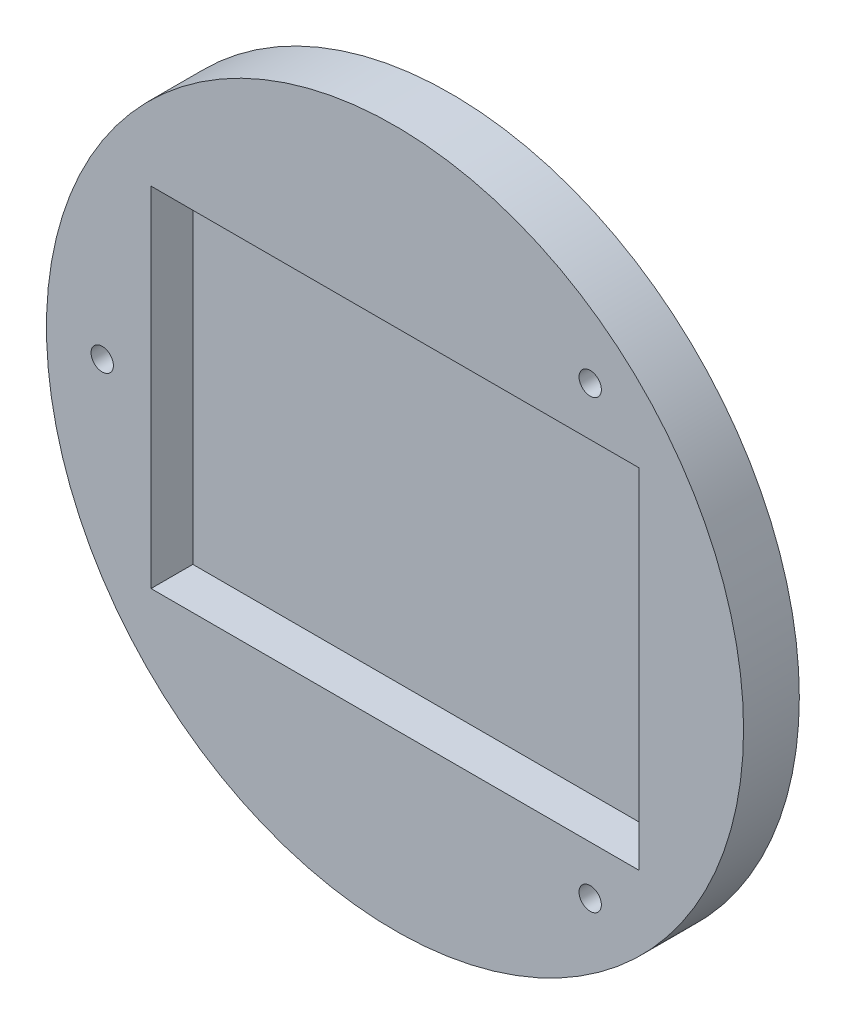
ISO-10303-21;
HEADER;
FILE_DESCRIPTION(('STEP AP214'),'2;1');
FILE_NAME('part.step','',(''),(''),'','','');
FILE_SCHEMA(('AUTOMOTIVE_DESIGN { 1 0 10303 214 1 1 1 1 }'));
ENDSEC;
DATA;
#1=APPLICATION_CONTEXT('core data for automotive mechanical design processes');
#2=APPLICATION_PROTOCOL_DEFINITION('international standard','automotive_design',2000,#1);
#3=PRODUCT_CONTEXT('',#1,'mechanical');
#4=PRODUCT('Part','Part','',(#3));
#5=PRODUCT_RELATED_PRODUCT_CATEGORY('part','',(#4));
#6=PRODUCT_DEFINITION_FORMATION('','',#4);
#7=PRODUCT_DEFINITION_CONTEXT('part definition',#1,'design');
#8=PRODUCT_DEFINITION('design','',#6,#7);
#9=PRODUCT_DEFINITION_SHAPE('','',#8);
#10=(LENGTH_UNIT() NAMED_UNIT(*) SI_UNIT(.MILLI.,.METRE.));
#11=(NAMED_UNIT(*) PLANE_ANGLE_UNIT() SI_UNIT($,.RADIAN.));
#12=(NAMED_UNIT(*) SI_UNIT($,.STERADIAN.) SOLID_ANGLE_UNIT());
#13=UNCERTAINTY_MEASURE_WITH_UNIT(LENGTH_MEASURE(1.E-05),#10,'distance_accuracy_value','');
#14=(GEOMETRIC_REPRESENTATION_CONTEXT(3) GLOBAL_UNCERTAINTY_ASSIGNED_CONTEXT((#13)) GLOBAL_UNIT_ASSIGNED_CONTEXT((#10,
#11,#12)) REPRESENTATION_CONTEXT('',''));
#15=CARTESIAN_POINT('',(0.,0.,0.));
#16=DIRECTION('',(0.,0.,1.));
#17=DIRECTION('',(1.,0.,0.));
#18=AXIS2_PLACEMENT_3D('',#15,#16,#17);
#19=CARTESIAN_POINT('',(0.,12.5,4.));
#20=DIRECTION('',(0.,1.,0.));
#21=DIRECTION('',(0.,0.,1.));
#22=AXIS2_PLACEMENT_3D('',#19,#20,#21);
#23=PLANE('',#22);
#24=DIRECTION('',(0.,0.,-1.));
#25=VECTOR('',#24,1.);
#26=CARTESIAN_POINT('',(-17.5,12.5,4.));
#27=LINE('',#26,#25);
#28=CARTESIAN_POINT('',(-17.5,12.5,4.));
#29=VERTEX_POINT('',#28);
#30=CARTESIAN_POINT('',(-17.5,12.5,1.));
#31=VERTEX_POINT('',#30);
#32=EDGE_CURVE('E91',#29,#31,#27,.T.);
#33=ORIENTED_EDGE('',*,*,#32,.T.);
#34=DIRECTION('',(1.,0.,0.));
#35=VECTOR('',#34,1.);
#36=CARTESIAN_POINT('',(0.,12.5,1.));
#37=LINE('',#36,#35);
#38=CARTESIAN_POINT('',(17.5,12.5,1.));
#39=VERTEX_POINT('',#38);
#40=EDGE_CURVE('E54',#31,#39,#37,.T.);
#41=ORIENTED_EDGE('',*,*,#40,.T.);
#42=DIRECTION('',(0.,0.,-1.));
#43=VECTOR('',#42,1.);
#44=CARTESIAN_POINT('',(17.5,12.5,4.));
#45=LINE('',#44,#43);
#46=CARTESIAN_POINT('',(17.5,12.5,4.));
#47=VERTEX_POINT('',#46);
#48=EDGE_CURVE('E11',#47,#39,#45,.T.);
#49=ORIENTED_EDGE('',*,*,#48,.F.);
#50=DIRECTION('',(1.,0.,0.));
#51=VECTOR('',#50,1.);
#52=CARTESIAN_POINT('',(0.,12.5,4.));
#53=LINE('',#52,#51);
#54=EDGE_CURVE('E107',#29,#47,#53,.T.);
#55=ORIENTED_EDGE('',*,*,#54,.F.);
#56=EDGE_LOOP('',(#33,#41,#49,#55));
#57=FACE_BOUND('',#56,.T.);
#58=ADVANCED_FACE('F38',(#57),#23,.F.);
#59=CARTESIAN_POINT('',(17.5,0.,4.));
#60=DIRECTION('',(1.,0.,0.));
#61=DIRECTION('',(0.,0.,-1.));
#62=AXIS2_PLACEMENT_3D('',#59,#60,#61);
#63=PLANE('',#62);
#64=ORIENTED_EDGE('',*,*,#48,.T.);
#65=DIRECTION('',(0.,-1.,0.));
#66=VECTOR('',#65,1.);
#67=CARTESIAN_POINT('',(17.5,0.,1.));
#68=LINE('',#67,#66);
#69=CARTESIAN_POINT('',(17.5,-12.5,1.));
#70=VERTEX_POINT('',#69);
#71=EDGE_CURVE('E60',#39,#70,#68,.T.);
#72=ORIENTED_EDGE('',*,*,#71,.T.);
#73=DIRECTION('',(0.,0.,-1.));
#74=VECTOR('',#73,1.);
#75=CARTESIAN_POINT('',(17.5,-12.5,4.));
#76=LINE('',#75,#74);
#77=CARTESIAN_POINT('',(17.5,-12.5,4.));
#78=VERTEX_POINT('',#77);
#79=EDGE_CURVE('E47',#78,#70,#76,.T.);
#80=ORIENTED_EDGE('',*,*,#79,.F.);
#81=DIRECTION('',(0.,-1.,0.));
#82=VECTOR('',#81,1.);
#83=CARTESIAN_POINT('',(17.5,0.,4.));
#84=LINE('',#83,#82);
#85=EDGE_CURVE('E110',#47,#78,#84,.T.);
#86=ORIENTED_EDGE('',*,*,#85,.F.);
#87=EDGE_LOOP('',(#64,#72,#80,#86));
#88=FACE_BOUND('',#87,.T.);
#89=ADVANCED_FACE('F121',(#88),#63,.F.);
#90=CARTESIAN_POINT('',(0.,-12.5,4.));
#91=DIRECTION('',(0.,1.,0.));
#92=DIRECTION('',(0.,0.,1.));
#93=AXIS2_PLACEMENT_3D('',#90,#91,#92);
#94=PLANE('',#93);
#95=DIRECTION('',(1.,0.,0.));
#96=VECTOR('',#95,1.);
#97=CARTESIAN_POINT('',(0.,-12.5,1.));
#98=LINE('',#97,#96);
#99=CARTESIAN_POINT('',(-17.5,-12.5,1.));
#100=VERTEX_POINT('',#99);
#101=EDGE_CURVE('E94',#100,#70,#98,.T.);
#102=ORIENTED_EDGE('',*,*,#101,.F.);
#103=DIRECTION('',(0.,0.,-1.));
#104=VECTOR('',#103,1.);
#105=CARTESIAN_POINT('',(-17.5,-12.5,4.));
#106=LINE('',#105,#104);
#107=CARTESIAN_POINT('',(-17.5,-12.5,4.));
#108=VERTEX_POINT('',#107);
#109=EDGE_CURVE('E81',#108,#100,#106,.T.);
#110=ORIENTED_EDGE('',*,*,#109,.F.);
#111=DIRECTION('',(1.,0.,0.));
#112=VECTOR('',#111,1.);
#113=CARTESIAN_POINT('',(0.,-12.5,4.));
#114=LINE('',#113,#112);
#115=EDGE_CURVE('E112',#108,#78,#114,.T.);
#116=ORIENTED_EDGE('',*,*,#115,.T.);
#117=ORIENTED_EDGE('',*,*,#79,.T.);
#118=EDGE_LOOP('',(#102,#110,#116,#117));
#119=FACE_BOUND('',#118,.T.);
#120=ADVANCED_FACE('F95',(#119),#94,.T.);
#121=CARTESIAN_POINT('',(0.,0.,4.));
#122=DIRECTION('',(0.,0.,-1.));
#123=DIRECTION('',(-1.,0.,0.));
#124=AXIS2_PLACEMENT_3D('',#121,#122,#123);
#125=CYLINDRICAL_SURFACE('',#124,25.);
#126=CARTESIAN_POINT('',(0.,0.,4.));
#127=DIRECTION('',(0.,0.,1.));
#128=DIRECTION('',(1.,0.,0.));
#129=AXIS2_PLACEMENT_3D('',#126,#127,#128);
#130=CIRCLE('',#129,25.);
#131=CARTESIAN_POINT('',(25.,0.,4.));
#132=VERTEX_POINT('',#131);
#133=EDGE_CURVE('E104',#132,#132,#130,.T.);
#134=ORIENTED_EDGE('',*,*,#133,.F.);
#135=EDGE_LOOP('',(#134));
#136=FACE_BOUND('',#135,.T.);
#137=CARTESIAN_POINT('',(0.,0.,0.));
#138=DIRECTION('',(0.,0.,1.));
#139=DIRECTION('',(1.,0.,0.));
#140=AXIS2_PLACEMENT_3D('',#137,#138,#139);
#141=CIRCLE('',#140,25.);
#142=CARTESIAN_POINT('',(25.,0.,0.));
#143=VERTEX_POINT('',#142);
#144=EDGE_CURVE('E97',#143,#143,#141,.T.);
#145=ORIENTED_EDGE('',*,*,#144,.T.);
#146=EDGE_LOOP('',(#145));
#147=FACE_BOUND('',#146,.T.);
#148=ADVANCED_FACE('F40',(#136,#147),#125,.T.);
#149=CARTESIAN_POINT('',(-17.5,0.,4.));
#150=DIRECTION('',(1.,0.,0.));
#151=DIRECTION('',(0.,1.,0.));
#152=AXIS2_PLACEMENT_3D('',#149,#150,#151);
#153=PLANE('',#152);
#154=DIRECTION('',(0.,-1.,0.));
#155=VECTOR('',#154,1.);
#156=CARTESIAN_POINT('',(-17.5,0.,1.));
#157=LINE('',#156,#155);
#158=EDGE_CURVE('E85',#31,#100,#157,.T.);
#159=ORIENTED_EDGE('',*,*,#158,.F.);
#160=ORIENTED_EDGE('',*,*,#32,.F.);
#161=DIRECTION('',(0.,-1.,0.));
#162=VECTOR('',#161,1.);
#163=CARTESIAN_POINT('',(-17.5,0.,4.));
#164=LINE('',#163,#162);
#165=EDGE_CURVE('E87',#29,#108,#164,.T.);
#166=ORIENTED_EDGE('',*,*,#165,.T.);
#167=ORIENTED_EDGE('',*,*,#109,.T.);
#168=EDGE_LOOP('',(#159,#160,#166,#167));
#169=FACE_BOUND('',#168,.T.);
#170=ADVANCED_FACE('F83',(#169),#153,.T.);
#171=CARTESIAN_POINT('',(0.,0.,4.));
#172=DIRECTION('',(0.,0.,1.));
#173=DIRECTION('',(1.,0.,0.));
#174=AXIS2_PLACEMENT_3D('',#171,#172,#173);
#175=PLANE('',#174);
#176=CARTESIAN_POINT('',(-21.,0.,4.));
#177=DIRECTION('',(0.,0.,1.));
#178=DIRECTION('',(1.,0.,0.));
#179=AXIS2_PLACEMENT_3D('',#176,#177,#178);
#180=CIRCLE('',#179,0.799999999999988);
#181=CARTESIAN_POINT('',(-20.2,0.,4.));
#182=VERTEX_POINT('',#181);
#183=EDGE_CURVE('E161',#182,#182,#180,.T.);
#184=ORIENTED_EDGE('',*,*,#183,.F.);
#185=EDGE_LOOP('',(#184));
#186=FACE_BOUND('',#185,.T.);
#187=CARTESIAN_POINT('',(14.,-16.,4.));
#188=DIRECTION('',(0.,0.,1.));
#189=DIRECTION('',(1.,0.,0.));
#190=AXIS2_PLACEMENT_3D('',#187,#188,#189);
#191=CIRCLE('',#190,0.799999999999988);
#192=CARTESIAN_POINT('',(14.8,-16.,4.));
#193=VERTEX_POINT('',#192);
#194=EDGE_CURVE('E164',#193,#193,#191,.T.);
#195=ORIENTED_EDGE('',*,*,#194,.F.);
#196=EDGE_LOOP('',(#195));
#197=FACE_BOUND('',#196,.T.);
#198=CARTESIAN_POINT('',(14.,16.,4.));
#199=DIRECTION('',(0.,0.,1.));
#200=DIRECTION('',(1.,0.,0.));
#201=AXIS2_PLACEMENT_3D('',#198,#199,#200);
#202=CIRCLE('',#201,0.799999999999988);
#203=CARTESIAN_POINT('',(14.8,16.,4.));
#204=VERTEX_POINT('',#203);
#205=EDGE_CURVE('E172',#204,#204,#202,.T.);
#206=ORIENTED_EDGE('',*,*,#205,.F.);
#207=EDGE_LOOP('',(#206));
#208=FACE_BOUND('',#207,.T.);
#209=ORIENTED_EDGE('',*,*,#133,.T.);
#210=EDGE_LOOP('',(#209));
#211=FACE_BOUND('',#210,.T.);
#212=ORIENTED_EDGE('',*,*,#54,.T.);
#213=ORIENTED_EDGE('',*,*,#85,.T.);
#214=ORIENTED_EDGE('',*,*,#115,.F.);
#215=ORIENTED_EDGE('',*,*,#165,.F.);
#216=EDGE_LOOP('',(#212,#213,#214,#215));
#217=FACE_BOUND('',#216,.T.);
#218=ADVANCED_FACE('F120',(#186,#197,#208,#211,#217),#175,.T.);
#219=CARTESIAN_POINT('',(0.,0.,0.));
#220=DIRECTION('',(0.,0.,1.));
#221=DIRECTION('',(1.,0.,0.));
#222=AXIS2_PLACEMENT_3D('',#219,#220,#221);
#223=PLANE('',#222);
#224=CARTESIAN_POINT('',(-21.,0.,0.));
#225=DIRECTION('',(0.,0.,1.));
#226=DIRECTION('',(1.,0.,0.));
#227=AXIS2_PLACEMENT_3D('',#224,#225,#226);
#228=CIRCLE('',#227,0.799999999999993);
#229=CARTESIAN_POINT('',(-20.2,0.,0.));
#230=VERTEX_POINT('',#229);
#231=EDGE_CURVE('E42',#230,#230,#228,.T.);
#232=ORIENTED_EDGE('',*,*,#231,.T.);
#233=EDGE_LOOP('',(#232));
#234=FACE_BOUND('',#233,.T.);
#235=CARTESIAN_POINT('',(14.,-16.,0.));
#236=DIRECTION('',(0.,0.,1.));
#237=DIRECTION('',(1.,0.,0.));
#238=AXIS2_PLACEMENT_3D('',#235,#236,#237);
#239=CIRCLE('',#238,0.799999999999993);
#240=CARTESIAN_POINT('',(14.8,-16.,0.));
#241=VERTEX_POINT('',#240);
#242=EDGE_CURVE('E166',#241,#241,#239,.T.);
#243=ORIENTED_EDGE('',*,*,#242,.T.);
#244=EDGE_LOOP('',(#243));
#245=FACE_BOUND('',#244,.T.);
#246=CARTESIAN_POINT('',(14.,16.,0.));
#247=DIRECTION('',(0.,0.,1.));
#248=DIRECTION('',(1.,0.,0.));
#249=AXIS2_PLACEMENT_3D('',#246,#247,#248);
#250=CIRCLE('',#249,0.799999999999993);
#251=CARTESIAN_POINT('',(14.8,16.,0.));
#252=VERTEX_POINT('',#251);
#253=EDGE_CURVE('E175',#252,#252,#250,.T.);
#254=ORIENTED_EDGE('',*,*,#253,.T.);
#255=EDGE_LOOP('',(#254));
#256=FACE_BOUND('',#255,.T.);
#257=CARTESIAN_POINT('',(0.,0.,0.));
#258=DIRECTION('',(0.,0.,-1.));
#259=DIRECTION('',(-1.,0.,0.));
#260=AXIS2_PLACEMENT_3D('',#257,#258,#259);
#261=CIRCLE('',#260,6.5);
#262=CARTESIAN_POINT('',(-6.5,0.,0.));
#263=VERTEX_POINT('',#262);
#264=EDGE_CURVE('E178',#263,#263,#261,.T.);
#265=ORIENTED_EDGE('',*,*,#264,.F.);
#266=EDGE_LOOP('',(#265));
#267=FACE_BOUND('',#266,.T.);
#268=ORIENTED_EDGE('',*,*,#144,.F.);
#269=EDGE_LOOP('',(#268));
#270=FACE_BOUND('',#269,.T.);
#271=ADVANCED_FACE('F132',(#234,#245,#256,#267,#270),#223,.F.);
#272=CARTESIAN_POINT('',(0.,0.,1.));
#273=DIRECTION('',(0.,0.,1.));
#274=DIRECTION('',(1.,0.,0.));
#275=AXIS2_PLACEMENT_3D('',#272,#273,#274);
#276=PLANE('',#275);
#277=ORIENTED_EDGE('',*,*,#71,.F.);
#278=ORIENTED_EDGE('',*,*,#40,.F.);
#279=ORIENTED_EDGE('',*,*,#158,.T.);
#280=ORIENTED_EDGE('',*,*,#101,.T.);
#281=EDGE_LOOP('',(#277,#278,#279,#280));
#282=FACE_BOUND('',#281,.T.);
#283=ADVANCED_FACE('F99',(#282),#276,.T.);
#284=CARTESIAN_POINT('',(0.,0.,0.));
#285=DIRECTION('',(0.,0.,-1.));
#286=DIRECTION('',(1.,0.,0.));
#287=AXIS2_PLACEMENT_3D('',#284,#285,#286);
#288=SPHERICAL_SURFACE('',#287,6.5);
#289=ORIENTED_EDGE('',*,*,#264,.T.);
#290=EDGE_LOOP('',(#289));
#291=FACE_BOUND('',#290,.T.);
#292=ADVANCED_FACE('F141',(#291),#288,.T.);
#293=CARTESIAN_POINT('',(14.,16.,4.));
#294=DIRECTION('',(0.,0.,1.));
#295=DIRECTION('',(1.,0.,0.));
#296=AXIS2_PLACEMENT_3D('',#293,#294,#295);
#297=CYLINDRICAL_SURFACE('',#296,0.799999999999993);
#298=ORIENTED_EDGE('',*,*,#205,.T.);
#299=EDGE_LOOP('',(#298));
#300=FACE_BOUND('',#299,.T.);
#301=ORIENTED_EDGE('',*,*,#253,.F.);
#302=EDGE_LOOP('',(#301));
#303=FACE_BOUND('',#302,.T.);
#304=ADVANCED_FACE('F144',(#300,#303),#297,.F.);
#305=CARTESIAN_POINT('',(14.,-16.,4.));
#306=DIRECTION('',(0.,0.,1.));
#307=DIRECTION('',(1.,0.,0.));
#308=AXIS2_PLACEMENT_3D('',#305,#306,#307);
#309=CYLINDRICAL_SURFACE('',#308,0.799999999999993);
#310=ORIENTED_EDGE('',*,*,#194,.T.);
#311=EDGE_LOOP('',(#310));
#312=FACE_BOUND('',#311,.T.);
#313=ORIENTED_EDGE('',*,*,#242,.F.);
#314=EDGE_LOOP('',(#313));
#315=FACE_BOUND('',#314,.T.);
#316=ADVANCED_FACE('F148',(#312,#315),#309,.F.);
#317=CARTESIAN_POINT('',(-21.,0.,4.));
#318=DIRECTION('',(0.,0.,1.));
#319=DIRECTION('',(1.,0.,0.));
#320=AXIS2_PLACEMENT_3D('',#317,#318,#319);
#321=CYLINDRICAL_SURFACE('',#320,0.799999999999993);
#322=ORIENTED_EDGE('',*,*,#183,.T.);
#323=EDGE_LOOP('',(#322));
#324=FACE_BOUND('',#323,.T.);
#325=ORIENTED_EDGE('',*,*,#231,.F.);
#326=EDGE_LOOP('',(#325));
#327=FACE_BOUND('',#326,.T.);
#328=ADVANCED_FACE('F152',(#324,#327),#321,.F.);
#329=CLOSED_SHELL('',(#58,#89,#120,#148,#170,#218,#271,#283,#292,#304,#316,#328));
#330=MANIFOLD_SOLID_BREP('B2',#329);
#331=ADVANCED_BREP_SHAPE_REPRESENTATION('',(#18,#330),#14);
#332=SHAPE_DEFINITION_REPRESENTATION(#9,#331);
ENDSEC;
END-ISO-10303-21;
